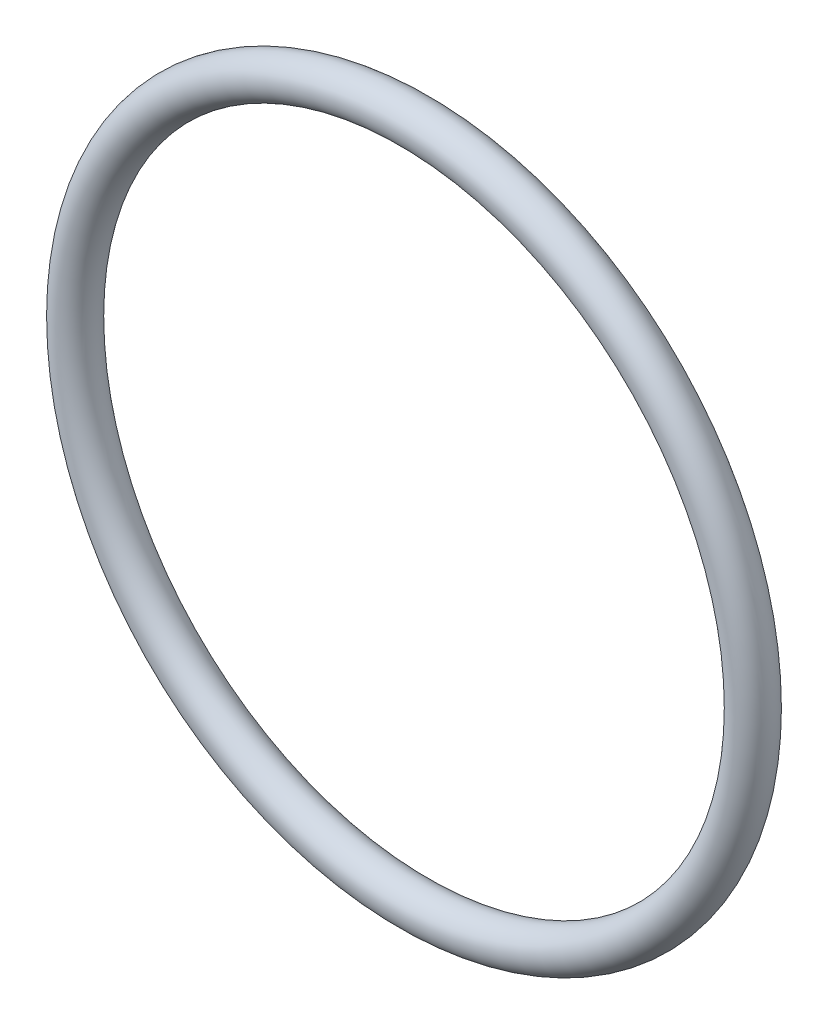
ISO-10303-21;
HEADER;
FILE_DESCRIPTION(('STEP AP214'),'2;1');
FILE_NAME('part.step','',(''),(''),'','','');
FILE_SCHEMA(('AUTOMOTIVE_DESIGN { 1 0 10303 214 1 1 1 1 }'));
ENDSEC;
DATA;
#1=APPLICATION_CONTEXT('core data for automotive mechanical design processes');
#2=APPLICATION_PROTOCOL_DEFINITION('international standard','automotive_design',2000,#1);
#3=PRODUCT_CONTEXT('',#1,'mechanical');
#4=PRODUCT('Part','Part','',(#3));
#5=PRODUCT_RELATED_PRODUCT_CATEGORY('part','',(#4));
#6=PRODUCT_DEFINITION_FORMATION('','',#4);
#7=PRODUCT_DEFINITION_CONTEXT('part definition',#1,'design');
#8=PRODUCT_DEFINITION('design','',#6,#7);
#9=PRODUCT_DEFINITION_SHAPE('','',#8);
#10=(LENGTH_UNIT() NAMED_UNIT(*) SI_UNIT(.MILLI.,.METRE.));
#11=(NAMED_UNIT(*) PLANE_ANGLE_UNIT() SI_UNIT($,.RADIAN.));
#12=(NAMED_UNIT(*) SI_UNIT($,.STERADIAN.) SOLID_ANGLE_UNIT());
#13=UNCERTAINTY_MEASURE_WITH_UNIT(LENGTH_MEASURE(1.E-05),#10,'distance_accuracy_value','');
#14=(GEOMETRIC_REPRESENTATION_CONTEXT(3) GLOBAL_UNCERTAINTY_ASSIGNED_CONTEXT((#13)) GLOBAL_UNIT_ASSIGNED_CONTEXT((#10,
#11,#12)) REPRESENTATION_CONTEXT('',''));
#15=CARTESIAN_POINT('',(0.,0.,0.));
#16=DIRECTION('',(0.,0.,1.));
#17=DIRECTION('',(1.,0.,0.));
#18=AXIS2_PLACEMENT_3D('',#15,#16,#17);
#19=CARTESIAN_POINT('',(0.,0.,0.));
#20=DIRECTION('',(0.,0.,1.));
#21=DIRECTION('',(1.,0.,0.));
#22=AXIS2_PLACEMENT_3D('',#19,#20,#21);
#23=TOROIDAL_SURFACE('',#22,21.8,1.3);
#24=CARTESIAN_POINT('',(23.1,0.,0.));
#25=VERTEX_POINT('',#24);
#26=VERTEX_LOOP('',#25);
#27=FACE_BOUND('',#26,.T.);
#28=ADVANCED_FACE('F38',(#27),#23,.T.);
#29=CLOSED_SHELL('',(#28));
#30=MANIFOLD_SOLID_BREP('B2',#29);
#31=ADVANCED_BREP_SHAPE_REPRESENTATION('',(#18,#30),#14);
#32=SHAPE_DEFINITION_REPRESENTATION(#9,#31);
ENDSEC;
END-ISO-10303-21;
